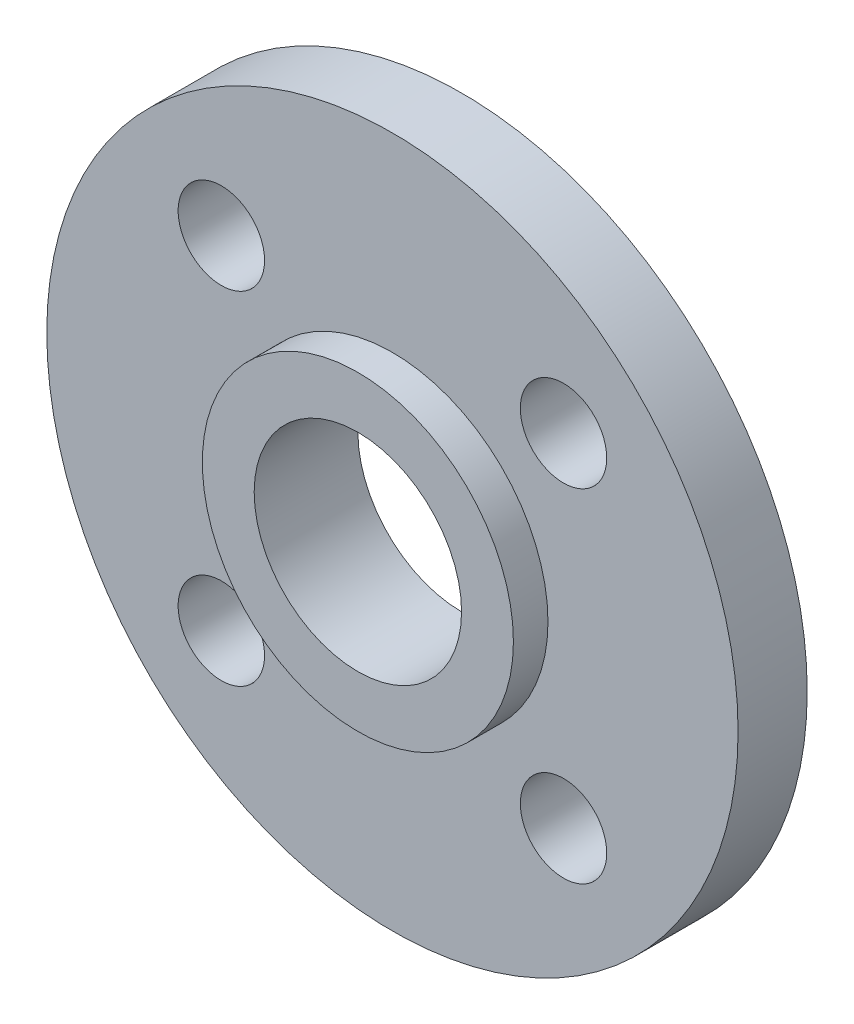
ISO-10303-21;
HEADER;
FILE_DESCRIPTION(('STEP AP214'),'2;1');
FILE_NAME('part.step','',(''),(''),'','','');
FILE_SCHEMA(('AUTOMOTIVE_DESIGN { 1 0 10303 214 1 1 1 1 }'));
ENDSEC;
DATA;
#1=APPLICATION_CONTEXT('core data for automotive mechanical design processes');
#2=APPLICATION_PROTOCOL_DEFINITION('international standard','automotive_design',2000,#1);
#3=PRODUCT_CONTEXT('',#1,'mechanical');
#4=PRODUCT('Part','Part','',(#3));
#5=PRODUCT_RELATED_PRODUCT_CATEGORY('part','',(#4));
#6=PRODUCT_DEFINITION_FORMATION('','',#4);
#7=PRODUCT_DEFINITION_CONTEXT('part definition',#1,'design');
#8=PRODUCT_DEFINITION('design','',#6,#7);
#9=PRODUCT_DEFINITION_SHAPE('','',#8);
#10=(LENGTH_UNIT() NAMED_UNIT(*) SI_UNIT(.MILLI.,.METRE.));
#11=(NAMED_UNIT(*) PLANE_ANGLE_UNIT() SI_UNIT($,.RADIAN.));
#12=(NAMED_UNIT(*) SI_UNIT($,.STERADIAN.) SOLID_ANGLE_UNIT());
#13=UNCERTAINTY_MEASURE_WITH_UNIT(LENGTH_MEASURE(1.E-05),#10,'distance_accuracy_value','');
#14=(GEOMETRIC_REPRESENTATION_CONTEXT(3) GLOBAL_UNCERTAINTY_ASSIGNED_CONTEXT((#13)) GLOBAL_UNIT_ASSIGNED_CONTEXT((#10,
#11,#12)) REPRESENTATION_CONTEXT('',''));
#15=CARTESIAN_POINT('',(0.,0.,0.));
#16=DIRECTION('',(0.,0.,1.));
#17=DIRECTION('',(1.,0.,0.));
#18=AXIS2_PLACEMENT_3D('',#15,#16,#17);
#19=CARTESIAN_POINT('',(0.,0.,2.));
#20=DIRECTION('',(0.,0.,1.));
#21=DIRECTION('',(1.,0.,0.));
#22=AXIS2_PLACEMENT_3D('',#19,#20,#21);
#23=PLANE('',#22);
#24=CARTESIAN_POINT('',(4.94974746830583,-4.94974746830583,2.));
#25=DIRECTION('',(0.,0.,1.));
#26=DIRECTION('',(1.,0.,0.));
#27=AXIS2_PLACEMENT_3D('',#24,#25,#26);
#28=CIRCLE('',#27,1.25);
#29=CARTESIAN_POINT('',(6.19974746830583,-4.94974746830583,2.));
#30=VERTEX_POINT('',#29);
#31=EDGE_CURVE('E56',#30,#30,#28,.T.);
#32=ORIENTED_EDGE('',*,*,#31,.F.);
#33=EDGE_LOOP('',(#32));
#34=FACE_BOUND('',#33,.T.);
#35=CARTESIAN_POINT('',(-4.94974746830583,4.94974746830583,2.));
#36=DIRECTION('',(0.,0.,1.));
#37=DIRECTION('',(1.,0.,0.));
#38=AXIS2_PLACEMENT_3D('',#35,#36,#37);
#39=CIRCLE('',#38,1.25);
#40=CARTESIAN_POINT('',(-3.69974746830583,4.94974746830583,2.));
#41=VERTEX_POINT('',#40);
#42=EDGE_CURVE('E45',#41,#41,#39,.T.);
#43=ORIENTED_EDGE('',*,*,#42,.F.);
#44=EDGE_LOOP('',(#43));
#45=FACE_BOUND('',#44,.T.);
#46=CARTESIAN_POINT('',(0.,0.,2.));
#47=DIRECTION('',(0.,0.,1.));
#48=DIRECTION('',(1.,0.,0.));
#49=AXIS2_PLACEMENT_3D('',#46,#47,#48);
#50=CIRCLE('',#49,10.);
#51=CARTESIAN_POINT('',(10.,0.,2.));
#52=VERTEX_POINT('',#51);
#53=EDGE_CURVE('E10',#52,#52,#50,.T.);
#54=ORIENTED_EDGE('',*,*,#53,.T.);
#55=EDGE_LOOP('',(#54));
#56=FACE_BOUND('',#55,.T.);
#57=CARTESIAN_POINT('',(4.94974746830583,4.94974746830583,2.));
#58=DIRECTION('',(0.,0.,1.));
#59=DIRECTION('',(1.,0.,0.));
#60=AXIS2_PLACEMENT_3D('',#57,#58,#59);
#61=CIRCLE('',#60,1.25);
#62=CARTESIAN_POINT('',(6.19974746830583,4.94974746830583,2.));
#63=VERTEX_POINT('',#62);
#64=EDGE_CURVE('E50',#63,#63,#61,.T.);
#65=ORIENTED_EDGE('',*,*,#64,.F.);
#66=EDGE_LOOP('',(#65));
#67=FACE_BOUND('',#66,.T.);
#68=CARTESIAN_POINT('',(-4.94974746830583,-4.94974746830583,2.));
#69=DIRECTION('',(0.,0.,1.));
#70=DIRECTION('',(1.,0.,0.));
#71=AXIS2_PLACEMENT_3D('',#68,#69,#70);
#72=CIRCLE('',#71,1.25);
#73=CARTESIAN_POINT('',(-3.69974746830583,-4.94974746830583,2.));
#74=VERTEX_POINT('',#73);
#75=EDGE_CURVE('E62',#74,#74,#72,.T.);
#76=ORIENTED_EDGE('',*,*,#75,.F.);
#77=EDGE_LOOP('',(#76));
#78=FACE_BOUND('',#77,.T.);
#79=CARTESIAN_POINT('',(0.,0.,2.));
#80=DIRECTION('',(0.,0.,1.));
#81=DIRECTION('',(1.,0.,0.));
#82=AXIS2_PLACEMENT_3D('',#79,#80,#81);
#83=CIRCLE('',#82,4.5);
#84=CARTESIAN_POINT('',(4.5,0.,2.));
#85=VERTEX_POINT('',#84);
#86=EDGE_CURVE('E74',#85,#85,#83,.T.);
#87=ORIENTED_EDGE('',*,*,#86,.F.);
#88=EDGE_LOOP('',(#87));
#89=FACE_BOUND('',#88,.T.);
#90=ADVANCED_FACE('F34',(#34,#45,#56,#67,#78,#89),#23,.T.);
#91=CARTESIAN_POINT('',(0.,0.,0.));
#92=DIRECTION('',(0.,0.,1.));
#93=DIRECTION('',(1.,0.,0.));
#94=AXIS2_PLACEMENT_3D('',#91,#92,#93);
#95=PLANE('',#94);
#96=CARTESIAN_POINT('',(0.,0.,0.));
#97=DIRECTION('',(0.,0.,1.));
#98=DIRECTION('',(1.,0.,0.));
#99=AXIS2_PLACEMENT_3D('',#96,#97,#98);
#100=CIRCLE('',#99,10.);
#101=CARTESIAN_POINT('',(10.,0.,0.));
#102=VERTEX_POINT('',#101);
#103=EDGE_CURVE('E38',#102,#102,#100,.T.);
#104=ORIENTED_EDGE('',*,*,#103,.F.);
#105=EDGE_LOOP('',(#104));
#106=FACE_BOUND('',#105,.T.);
#107=CARTESIAN_POINT('',(-4.94974746830583,4.94974746830583,0.));
#108=DIRECTION('',(0.,0.,1.));
#109=DIRECTION('',(1.,0.,0.));
#110=AXIS2_PLACEMENT_3D('',#107,#108,#109);
#111=CIRCLE('',#110,1.25);
#112=CARTESIAN_POINT('',(-3.69974746830583,4.94974746830583,0.));
#113=VERTEX_POINT('',#112);
#114=EDGE_CURVE('E47',#113,#113,#111,.T.);
#115=ORIENTED_EDGE('',*,*,#114,.T.);
#116=EDGE_LOOP('',(#115));
#117=FACE_BOUND('',#116,.T.);
#118=CARTESIAN_POINT('',(4.94974746830583,4.94974746830583,0.));
#119=DIRECTION('',(0.,0.,1.));
#120=DIRECTION('',(1.,0.,0.));
#121=AXIS2_PLACEMENT_3D('',#118,#119,#120);
#122=CIRCLE('',#121,1.25);
#123=CARTESIAN_POINT('',(6.19974746830583,4.94974746830583,0.));
#124=VERTEX_POINT('',#123);
#125=EDGE_CURVE('E53',#124,#124,#122,.T.);
#126=ORIENTED_EDGE('',*,*,#125,.T.);
#127=EDGE_LOOP('',(#126));
#128=FACE_BOUND('',#127,.T.);
#129=CARTESIAN_POINT('',(4.94974746830583,-4.94974746830583,0.));
#130=DIRECTION('',(0.,0.,1.));
#131=DIRECTION('',(1.,0.,0.));
#132=AXIS2_PLACEMENT_3D('',#129,#130,#131);
#133=CIRCLE('',#132,1.25);
#134=CARTESIAN_POINT('',(6.19974746830583,-4.94974746830583,0.));
#135=VERTEX_POINT('',#134);
#136=EDGE_CURVE('E59',#135,#135,#133,.T.);
#137=ORIENTED_EDGE('',*,*,#136,.T.);
#138=EDGE_LOOP('',(#137));
#139=FACE_BOUND('',#138,.T.);
#140=CARTESIAN_POINT('',(-4.94974746830583,-4.94974746830583,0.));
#141=DIRECTION('',(0.,0.,1.));
#142=DIRECTION('',(1.,0.,0.));
#143=AXIS2_PLACEMENT_3D('',#140,#141,#142);
#144=CIRCLE('',#143,1.25);
#145=CARTESIAN_POINT('',(-3.69974746830583,-4.94974746830583,0.));
#146=VERTEX_POINT('',#145);
#147=EDGE_CURVE('E65',#146,#146,#144,.T.);
#148=ORIENTED_EDGE('',*,*,#147,.T.);
#149=EDGE_LOOP('',(#148));
#150=FACE_BOUND('',#149,.T.);
#151=CARTESIAN_POINT('',(0.,0.,0.));
#152=DIRECTION('',(0.,0.,1.));
#153=DIRECTION('',(1.,0.,0.));
#154=AXIS2_PLACEMENT_3D('',#151,#152,#153);
#155=CIRCLE('',#154,3.);
#156=CARTESIAN_POINT('',(3.,0.,0.));
#157=VERTEX_POINT('',#156);
#158=EDGE_CURVE('E68',#157,#157,#155,.T.);
#159=ORIENTED_EDGE('',*,*,#158,.T.);
#160=EDGE_LOOP('',(#159));
#161=FACE_BOUND('',#160,.T.);
#162=ADVANCED_FACE('F100',(#106,#117,#128,#139,#150,#161),#95,.F.);
#163=CARTESIAN_POINT('',(0.,0.,2.));
#164=DIRECTION('',(0.,0.,-1.));
#165=DIRECTION('',(-1.,0.,0.));
#166=AXIS2_PLACEMENT_3D('',#163,#164,#165);
#167=CYLINDRICAL_SURFACE('',#166,10.);
#168=ORIENTED_EDGE('',*,*,#53,.F.);
#169=EDGE_LOOP('',(#168));
#170=FACE_BOUND('',#169,.T.);
#171=ORIENTED_EDGE('',*,*,#103,.T.);
#172=EDGE_LOOP('',(#171));
#173=FACE_BOUND('',#172,.T.);
#174=ADVANCED_FACE('F36',(#170,#173),#167,.T.);
#175=CARTESIAN_POINT('',(-4.94974746830583,4.94974746830583,2.));
#176=DIRECTION('',(0.,0.,-1.));
#177=DIRECTION('',(-1.,0.,0.));
#178=AXIS2_PLACEMENT_3D('',#175,#176,#177);
#179=CYLINDRICAL_SURFACE('',#178,1.25);
#180=ORIENTED_EDGE('',*,*,#42,.T.);
#181=EDGE_LOOP('',(#180));
#182=FACE_BOUND('',#181,.T.);
#183=ORIENTED_EDGE('',*,*,#114,.F.);
#184=EDGE_LOOP('',(#183));
#185=FACE_BOUND('',#184,.T.);
#186=ADVANCED_FACE('F110',(#182,#185),#179,.F.);
#187=CARTESIAN_POINT('',(4.94974746830583,4.94974746830583,2.));
#188=DIRECTION('',(0.,0.,-1.));
#189=DIRECTION('',(-1.,0.,0.));
#190=AXIS2_PLACEMENT_3D('',#187,#188,#189);
#191=CYLINDRICAL_SURFACE('',#190,1.25);
#192=ORIENTED_EDGE('',*,*,#64,.T.);
#193=EDGE_LOOP('',(#192));
#194=FACE_BOUND('',#193,.T.);
#195=ORIENTED_EDGE('',*,*,#125,.F.);
#196=EDGE_LOOP('',(#195));
#197=FACE_BOUND('',#196,.T.);
#198=ADVANCED_FACE('F113',(#194,#197),#191,.F.);
#199=CARTESIAN_POINT('',(4.94974746830583,-4.94974746830583,2.));
#200=DIRECTION('',(0.,0.,-1.));
#201=DIRECTION('',(-1.,0.,0.));
#202=AXIS2_PLACEMENT_3D('',#199,#200,#201);
#203=CYLINDRICAL_SURFACE('',#202,1.25);
#204=ORIENTED_EDGE('',*,*,#31,.T.);
#205=EDGE_LOOP('',(#204));
#206=FACE_BOUND('',#205,.T.);
#207=ORIENTED_EDGE('',*,*,#136,.F.);
#208=EDGE_LOOP('',(#207));
#209=FACE_BOUND('',#208,.T.);
#210=ADVANCED_FACE('F117',(#206,#209),#203,.F.);
#211=CARTESIAN_POINT('',(-4.94974746830583,-4.94974746830583,2.));
#212=DIRECTION('',(0.,0.,-1.));
#213=DIRECTION('',(-1.,0.,0.));
#214=AXIS2_PLACEMENT_3D('',#211,#212,#213);
#215=CYLINDRICAL_SURFACE('',#214,1.25);
#216=ORIENTED_EDGE('',*,*,#75,.T.);
#217=EDGE_LOOP('',(#216));
#218=FACE_BOUND('',#217,.T.);
#219=ORIENTED_EDGE('',*,*,#147,.F.);
#220=EDGE_LOOP('',(#219));
#221=FACE_BOUND('',#220,.T.);
#222=ADVANCED_FACE('F96',(#218,#221),#215,.F.);
#223=CARTESIAN_POINT('',(0.,0.,2.));
#224=DIRECTION('',(0.,0.,-1.));
#225=DIRECTION('',(-1.,0.,0.));
#226=AXIS2_PLACEMENT_3D('',#223,#224,#225);
#227=CYLINDRICAL_SURFACE('',#226,3.);
#228=ORIENTED_EDGE('',*,*,#158,.F.);
#229=EDGE_LOOP('',(#228));
#230=FACE_BOUND('',#229,.T.);
#231=CARTESIAN_POINT('',(0.,0.,3.));
#232=DIRECTION('',(0.,0.,1.));
#233=DIRECTION('',(1.,0.,0.));
#234=AXIS2_PLACEMENT_3D('',#231,#232,#233);
#235=CIRCLE('',#234,3.);
#236=CARTESIAN_POINT('',(3.,0.,3.));
#237=VERTEX_POINT('',#236);
#238=EDGE_CURVE('E77',#237,#237,#235,.T.);
#239=ORIENTED_EDGE('',*,*,#238,.T.);
#240=EDGE_LOOP('',(#239));
#241=FACE_BOUND('',#240,.T.);
#242=ADVANCED_FACE('F83',(#230,#241),#227,.F.);
#243=CARTESIAN_POINT('',(0.,0.,3.));
#244=DIRECTION('',(0.,0.,1.));
#245=DIRECTION('',(1.,0.,0.));
#246=AXIS2_PLACEMENT_3D('',#243,#244,#245);
#247=PLANE('',#246);
#248=CARTESIAN_POINT('',(0.,0.,3.));
#249=DIRECTION('',(0.,0.,1.));
#250=DIRECTION('',(1.,0.,0.));
#251=AXIS2_PLACEMENT_3D('',#248,#249,#250);
#252=CIRCLE('',#251,4.5);
#253=CARTESIAN_POINT('',(4.5,0.,3.));
#254=VERTEX_POINT('',#253);
#255=EDGE_CURVE('E73',#254,#254,#252,.T.);
#256=ORIENTED_EDGE('',*,*,#255,.T.);
#257=EDGE_LOOP('',(#256));
#258=FACE_BOUND('',#257,.T.);
#259=ORIENTED_EDGE('',*,*,#238,.F.);
#260=EDGE_LOOP('',(#259));
#261=FACE_BOUND('',#260,.T.);
#262=ADVANCED_FACE('F85',(#258,#261),#247,.T.);
#263=CARTESIAN_POINT('',(0.,0.,3.));
#264=DIRECTION('',(0.,0.,-1.));
#265=DIRECTION('',(-1.,0.,0.));
#266=AXIS2_PLACEMENT_3D('',#263,#264,#265);
#267=CYLINDRICAL_SURFACE('',#266,4.5);
#268=ORIENTED_EDGE('',*,*,#255,.F.);
#269=EDGE_LOOP('',(#268));
#270=FACE_BOUND('',#269,.T.);
#271=ORIENTED_EDGE('',*,*,#86,.T.);
#272=EDGE_LOOP('',(#271));
#273=FACE_BOUND('',#272,.T.);
#274=ADVANCED_FACE('F87',(#270,#273),#267,.T.);
#275=CLOSED_SHELL('',(#90,#162,#174,#186,#198,#210,#222,#242,#262,#274));
#276=MANIFOLD_SOLID_BREP('B2',#275);
#277=ADVANCED_BREP_SHAPE_REPRESENTATION('',(#18,#276),#14);
#278=SHAPE_DEFINITION_REPRESENTATION(#9,#277);
ENDSEC;
END-ISO-10303-21;
